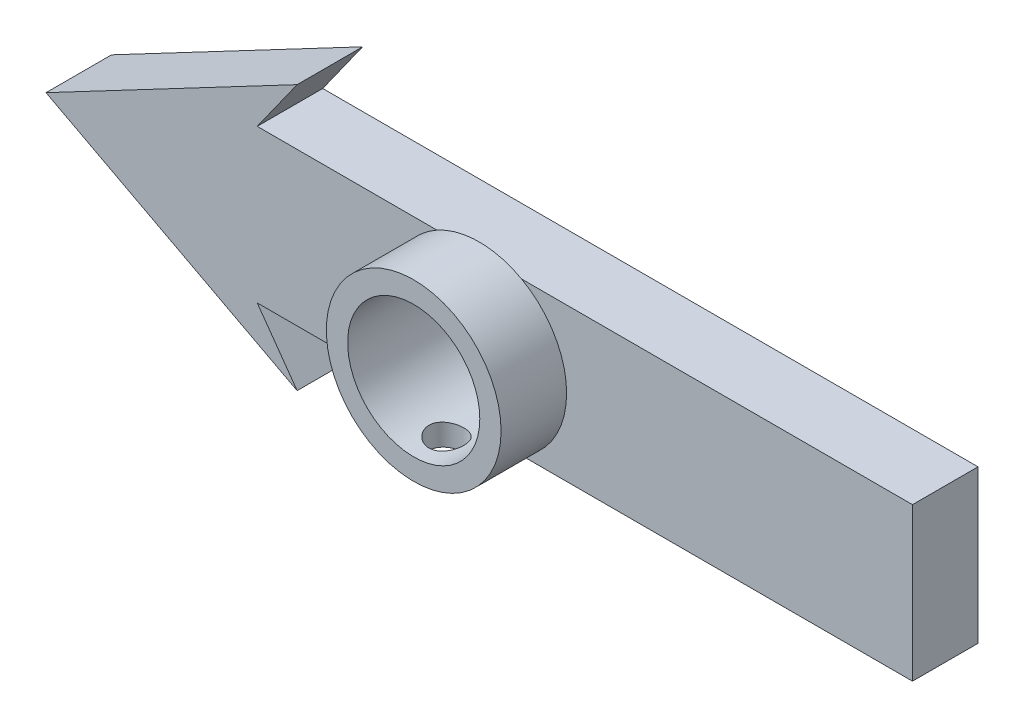
ISO-10303-21;
HEADER;
FILE_DESCRIPTION(('STEP AP214'),'2;1');
FILE_NAME('part.step','',(''),(''),'','','');
FILE_SCHEMA(('AUTOMOTIVE_DESIGN { 1 0 10303 214 1 1 1 1 }'));
ENDSEC;
DATA;
#1=APPLICATION_CONTEXT('core data for automotive mechanical design processes');
#2=APPLICATION_PROTOCOL_DEFINITION('international standard','automotive_design',2000,#1);
#3=PRODUCT_CONTEXT('',#1,'mechanical');
#4=PRODUCT('Part','Part','',(#3));
#5=PRODUCT_RELATED_PRODUCT_CATEGORY('part','',(#4));
#6=PRODUCT_DEFINITION_FORMATION('','',#4);
#7=PRODUCT_DEFINITION_CONTEXT('part definition',#1,'design');
#8=PRODUCT_DEFINITION('design','',#6,#7);
#9=PRODUCT_DEFINITION_SHAPE('','',#8);
#10=(LENGTH_UNIT() NAMED_UNIT(*) SI_UNIT(.MILLI.,.METRE.));
#11=(NAMED_UNIT(*) PLANE_ANGLE_UNIT() SI_UNIT($,.RADIAN.));
#12=(NAMED_UNIT(*) SI_UNIT($,.STERADIAN.) SOLID_ANGLE_UNIT());
#13=UNCERTAINTY_MEASURE_WITH_UNIT(LENGTH_MEASURE(1.E-05),#10,'distance_accuracy_value','');
#14=(GEOMETRIC_REPRESENTATION_CONTEXT(3) GLOBAL_UNCERTAINTY_ASSIGNED_CONTEXT((#13)) GLOBAL_UNIT_ASSIGNED_CONTEXT((#10,
#11,#12)) REPRESENTATION_CONTEXT('',''));
#15=CARTESIAN_POINT('',(0.,0.,0.));
#16=DIRECTION('',(0.,0.,1.));
#17=DIRECTION('',(1.,0.,0.));
#18=AXIS2_PLACEMENT_3D('',#15,#16,#17);
#19=CARTESIAN_POINT('',(0.,0.,3.));
#20=DIRECTION('',(0.,0.,-1.));
#21=DIRECTION('',(-1.,0.,0.));
#22=AXIS2_PLACEMENT_3D('',#19,#20,#21);
#23=PLANE('',#22);
#24=CARTESIAN_POINT('',(19.8350401846511,0.,3.));
#25=DIRECTION('',(0.,0.,1.));
#26=DIRECTION('',(1.,0.,0.));
#27=AXIS2_PLACEMENT_3D('',#24,#25,#26);
#28=CIRCLE('',#27,4.);
#29=CARTESIAN_POINT('',(17.8985485115474,3.5,3.));
#30=VERTEX_POINT('',#29);
#31=CARTESIAN_POINT('',(17.8985485115474,-3.5,3.));
#32=VERTEX_POINT('',#31);
#33=EDGE_CURVE('E11',#30,#32,#28,.T.);
#34=ORIENTED_EDGE('',*,*,#33,.F.);
#35=DIRECTION('',(-1.,0.,0.));
#36=VECTOR('',#35,1.);
#37=CARTESIAN_POINT('',(9.67008036930227,3.5,3.));
#38=LINE('',#37,#36);
#39=CARTESIAN_POINT('',(9.67008036930227,3.5,3.));
#40=VERTEX_POINT('',#39);
#41=EDGE_CURVE('E116',#30,#40,#38,.T.);
#42=ORIENTED_EDGE('',*,*,#41,.T.);
#43=DIRECTION('',(0.580022620305098,0.814600368238567,0.));
#44=VECTOR('',#43,1.);
#45=CARTESIAN_POINT('',(11.4976326065654,6.06666666666667,3.));
#46=LINE('',#45,#44);
#47=CARTESIAN_POINT('',(11.4976326065654,6.06666666666667,3.));
#48=VERTEX_POINT('',#47);
#49=EDGE_CURVE('E113',#40,#48,#46,.T.);
#50=ORIENTED_EDGE('',*,*,#49,.T.);
#51=DIRECTION('',(-0.884433277428106,-0.466666666666667,0.));
#52=VECTOR('',#51,1.);
#53=CARTESIAN_POINT('',(0.,0.,3.));
#54=LINE('',#53,#52);
#55=CARTESIAN_POINT('',(0.,0.,3.));
#56=VERTEX_POINT('',#55);
#57=EDGE_CURVE('E148',#48,#56,#54,.T.);
#58=ORIENTED_EDGE('',*,*,#57,.T.);
#59=DIRECTION('',(0.884433277428106,-0.466666666666667,0.));
#60=VECTOR('',#59,1.);
#61=CARTESIAN_POINT('',(0.,0.,3.));
#62=LINE('',#61,#60);
#63=CARTESIAN_POINT('',(11.4976326065654,-6.06666666666667,3.));
#64=VERTEX_POINT('',#63);
#65=EDGE_CURVE('E136',#56,#64,#62,.T.);
#66=ORIENTED_EDGE('',*,*,#65,.T.);
#67=DIRECTION('',(-0.580022620305098,0.814600368238567,0.));
#68=VECTOR('',#67,1.);
#69=CARTESIAN_POINT('',(11.4976326065654,-6.06666666666667,3.));
#70=LINE('',#69,#68);
#71=CARTESIAN_POINT('',(9.67008036930227,-3.5,3.));
#72=VERTEX_POINT('',#71);
#73=EDGE_CURVE('E139',#64,#72,#70,.T.);
#74=ORIENTED_EDGE('',*,*,#73,.T.);
#75=DIRECTION('',(1.,0.,0.));
#76=VECTOR('',#75,1.);
#77=CARTESIAN_POINT('',(9.67008036930227,-3.5,3.));
#78=LINE('',#77,#76);
#79=EDGE_CURVE('E143',#72,#32,#78,.T.);
#80=ORIENTED_EDGE('',*,*,#79,.T.);
#81=EDGE_LOOP('',(#34,#42,#50,#58,#66,#74,#80));
#82=FACE_BOUND('',#81,.T.);
#83=ADVANCED_FACE('F35',(#82),#23,.F.);
#84=CARTESIAN_POINT('',(0.,0.,3.));
#85=DIRECTION('',(0.466666666666667,0.884433277428107,0.));
#86=DIRECTION('',(-0.884433277428107,0.466666666666667,0.));
#87=AXIS2_PLACEMENT_3D('',#84,#85,#86);
#88=PLANE('',#87);
#89=DIRECTION('',(0.884433277428106,-0.466666666666667,0.));
#90=VECTOR('',#89,1.);
#91=CARTESIAN_POINT('',(0.,0.,0.));
#92=LINE('',#91,#90);
#93=CARTESIAN_POINT('',(0.,0.,0.));
#94=VERTEX_POINT('',#93);
#95=CARTESIAN_POINT('',(11.4976326065654,-6.06666666666667,0.));
#96=VERTEX_POINT('',#95);
#97=EDGE_CURVE('E131',#94,#96,#92,.T.);
#98=ORIENTED_EDGE('',*,*,#97,.T.);
#99=DIRECTION('',(0.,0.,-1.));
#100=VECTOR('',#99,1.);
#101=CARTESIAN_POINT('',(11.4976326065654,-6.06666666666667,3.));
#102=LINE('',#101,#100);
#103=EDGE_CURVE('E39',#64,#96,#102,.T.);
#104=ORIENTED_EDGE('',*,*,#103,.F.);
#105=ORIENTED_EDGE('',*,*,#65,.F.);
#106=DIRECTION('',(0.,0.,-1.));
#107=VECTOR('',#106,1.);
#108=CARTESIAN_POINT('',(0.,0.,3.));
#109=LINE('',#108,#107);
#110=EDGE_CURVE('E150',#56,#94,#109,.T.);
#111=ORIENTED_EDGE('',*,*,#110,.T.);
#112=EDGE_LOOP('',(#98,#104,#105,#111));
#113=FACE_BOUND('',#112,.T.);
#114=ADVANCED_FACE('F37',(#113),#88,.F.);
#115=CARTESIAN_POINT('',(11.4976326065654,-6.06666666666667,3.));
#116=DIRECTION('',(-0.814600368238567,-0.580022620305098,0.));
#117=DIRECTION('',(0.580022620305098,-0.814600368238567,0.));
#118=AXIS2_PLACEMENT_3D('',#115,#116,#117);
#119=PLANE('',#118);
#120=DIRECTION('',(-0.580022620305098,0.814600368238567,0.));
#121=VECTOR('',#120,1.);
#122=CARTESIAN_POINT('',(11.4976326065654,-6.06666666666667,0.));
#123=LINE('',#122,#121);
#124=CARTESIAN_POINT('',(9.67008036930227,-3.5,0.));
#125=VERTEX_POINT('',#124);
#126=EDGE_CURVE('E153',#96,#125,#123,.T.);
#127=ORIENTED_EDGE('',*,*,#126,.T.);
#128=DIRECTION('',(0.,0.,-1.));
#129=VECTOR('',#128,1.);
#130=CARTESIAN_POINT('',(9.67008036930227,-3.5,3.));
#131=LINE('',#130,#129);
#132=EDGE_CURVE('E176',#72,#125,#131,.T.);
#133=ORIENTED_EDGE('',*,*,#132,.F.);
#134=ORIENTED_EDGE('',*,*,#73,.F.);
#135=ORIENTED_EDGE('',*,*,#103,.T.);
#136=EDGE_LOOP('',(#127,#133,#134,#135));
#137=FACE_BOUND('',#136,.T.);
#138=ADVANCED_FACE('F185',(#137),#119,.F.);
#139=CARTESIAN_POINT('',(9.67008036930227,-3.5,3.));
#140=DIRECTION('',(0.,1.,0.));
#141=DIRECTION('',(-1.,0.,0.));
#142=AXIS2_PLACEMENT_3D('',#139,#140,#141);
#143=PLANE('',#142);
#144=DIRECTION('',(1.,0.,0.));
#145=VECTOR('',#144,1.);
#146=CARTESIAN_POINT('',(9.67008036930227,-3.5,0.));
#147=LINE('',#146,#145);
#148=CARTESIAN_POINT('',(39.6700803693023,-3.5,0.));
#149=VERTEX_POINT('',#148);
#150=EDGE_CURVE('E155',#125,#149,#147,.T.);
#151=ORIENTED_EDGE('',*,*,#150,.T.);
#152=DIRECTION('',(0.,0.,-1.));
#153=VECTOR('',#152,1.);
#154=CARTESIAN_POINT('',(39.6700803693023,-3.5,3.));
#155=LINE('',#154,#153);
#156=CARTESIAN_POINT('',(39.6700803693023,-3.5,3.));
#157=VERTEX_POINT('',#156);
#158=EDGE_CURVE('E174',#157,#149,#155,.T.);
#159=ORIENTED_EDGE('',*,*,#158,.F.);
#160=CARTESIAN_POINT('',(21.7715318577548,-3.5,3.));
#161=VERTEX_POINT('',#160);
#162=EDGE_CURVE('E142',#161,#157,#78,.T.);
#163=ORIENTED_EDGE('',*,*,#162,.F.);
#164=EDGE_CURVE('E145',#32,#161,#78,.T.);
#165=ORIENTED_EDGE('',*,*,#164,.F.);
#166=ORIENTED_EDGE('',*,*,#79,.F.);
#167=ORIENTED_EDGE('',*,*,#132,.T.);
#168=EDGE_LOOP('',(#151,#159,#163,#165,#166,#167));
#169=FACE_BOUND('',#168,.T.);
#170=ADVANCED_FACE('F197',(#169),#143,.F.);
#171=CARTESIAN_POINT('',(39.6700803693023,3.5,3.));
#172=DIRECTION('',(-1.,0.,0.));
#173=DIRECTION('',(0.,0.,1.));
#174=AXIS2_PLACEMENT_3D('',#171,#172,#173);
#175=PLANE('',#174);
#176=DIRECTION('',(0.,1.,0.));
#177=VECTOR('',#176,1.);
#178=CARTESIAN_POINT('',(39.6700803693023,3.5,0.));
#179=LINE('',#178,#177);
#180=CARTESIAN_POINT('',(39.6700803693023,3.5,0.));
#181=VERTEX_POINT('',#180);
#182=EDGE_CURVE('E157',#149,#181,#179,.T.);
#183=ORIENTED_EDGE('',*,*,#182,.T.);
#184=DIRECTION('',(0.,0.,-1.));
#185=VECTOR('',#184,1.);
#186=CARTESIAN_POINT('',(39.6700803693023,3.5,3.));
#187=LINE('',#186,#185);
#188=CARTESIAN_POINT('',(39.6700803693023,3.5,3.));
#189=VERTEX_POINT('',#188);
#190=EDGE_CURVE('E172',#189,#181,#187,.T.);
#191=ORIENTED_EDGE('',*,*,#190,.F.);
#192=DIRECTION('',(0.,1.,0.));
#193=VECTOR('',#192,1.);
#194=CARTESIAN_POINT('',(39.6700803693023,3.5,3.));
#195=LINE('',#194,#193);
#196=EDGE_CURVE('E109',#157,#189,#195,.T.);
#197=ORIENTED_EDGE('',*,*,#196,.F.);
#198=ORIENTED_EDGE('',*,*,#158,.T.);
#199=EDGE_LOOP('',(#183,#191,#197,#198));
#200=FACE_BOUND('',#199,.T.);
#201=ADVANCED_FACE('F199',(#200),#175,.F.);
#202=CARTESIAN_POINT('',(9.67008036930227,3.5,3.));
#203=DIRECTION('',(0.,-1.,0.));
#204=DIRECTION('',(1.,0.,0.));
#205=AXIS2_PLACEMENT_3D('',#202,#203,#204);
#206=PLANE('',#205);
#207=DIRECTION('',(-1.,0.,0.));
#208=VECTOR('',#207,1.);
#209=CARTESIAN_POINT('',(9.67008036930227,3.5,0.));
#210=LINE('',#209,#208);
#211=CARTESIAN_POINT('',(9.67008036930227,3.5,0.));
#212=VERTEX_POINT('',#211);
#213=EDGE_CURVE('E159',#181,#212,#210,.T.);
#214=ORIENTED_EDGE('',*,*,#213,.T.);
#215=DIRECTION('',(0.,0.,-1.));
#216=VECTOR('',#215,1.);
#217=CARTESIAN_POINT('',(9.67008036930227,3.5,3.));
#218=LINE('',#217,#216);
#219=EDGE_CURVE('E169',#40,#212,#218,.T.);
#220=ORIENTED_EDGE('',*,*,#219,.F.);
#221=ORIENTED_EDGE('',*,*,#41,.F.);
#222=CARTESIAN_POINT('',(21.7715318577548,3.5,3.));
#223=VERTEX_POINT('',#222);
#224=EDGE_CURVE('E114',#223,#30,#38,.T.);
#225=ORIENTED_EDGE('',*,*,#224,.F.);
#226=EDGE_CURVE('E105',#189,#223,#38,.T.);
#227=ORIENTED_EDGE('',*,*,#226,.F.);
#228=ORIENTED_EDGE('',*,*,#190,.T.);
#229=EDGE_LOOP('',(#214,#220,#221,#225,#227,#228));
#230=FACE_BOUND('',#229,.T.);
#231=ADVANCED_FACE('F118',(#230),#206,.F.);
#232=CARTESIAN_POINT('',(11.4976326065654,6.06666666666667,3.));
#233=DIRECTION('',(-0.814600368238567,0.580022620305098,0.));
#234=DIRECTION('',(-0.580022620305098,-0.814600368238567,0.));
#235=AXIS2_PLACEMENT_3D('',#232,#233,#234);
#236=PLANE('',#235);
#237=DIRECTION('',(0.580022620305098,0.814600368238567,0.));
#238=VECTOR('',#237,1.);
#239=CARTESIAN_POINT('',(11.4976326065654,6.06666666666667,0.));
#240=LINE('',#239,#238);
#241=CARTESIAN_POINT('',(11.4976326065654,6.06666666666667,0.));
#242=VERTEX_POINT('',#241);
#243=EDGE_CURVE('E161',#212,#242,#240,.T.);
#244=ORIENTED_EDGE('',*,*,#243,.T.);
#245=DIRECTION('',(0.,0.,-1.));
#246=VECTOR('',#245,1.);
#247=CARTESIAN_POINT('',(11.4976326065654,6.06666666666667,3.));
#248=LINE('',#247,#246);
#249=EDGE_CURVE('E166',#48,#242,#248,.T.);
#250=ORIENTED_EDGE('',*,*,#249,.F.);
#251=ORIENTED_EDGE('',*,*,#49,.F.);
#252=ORIENTED_EDGE('',*,*,#219,.T.);
#253=EDGE_LOOP('',(#244,#250,#251,#252));
#254=FACE_BOUND('',#253,.T.);
#255=ADVANCED_FACE('F202',(#254),#236,.F.);
#256=CARTESIAN_POINT('',(0.,0.,3.));
#257=DIRECTION('',(0.466666666666667,-0.884433277428107,0.));
#258=DIRECTION('',(0.884433277428107,0.466666666666667,0.));
#259=AXIS2_PLACEMENT_3D('',#256,#257,#258);
#260=PLANE('',#259);
#261=DIRECTION('',(-0.884433277428106,-0.466666666666667,0.));
#262=VECTOR('',#261,1.);
#263=CARTESIAN_POINT('',(0.,0.,0.));
#264=LINE('',#263,#262);
#265=EDGE_CURVE('E140',#242,#94,#264,.T.);
#266=ORIENTED_EDGE('',*,*,#265,.T.);
#267=ORIENTED_EDGE('',*,*,#110,.F.);
#268=ORIENTED_EDGE('',*,*,#57,.F.);
#269=ORIENTED_EDGE('',*,*,#249,.T.);
#270=EDGE_LOOP('',(#266,#267,#268,#269));
#271=FACE_BOUND('',#270,.T.);
#272=ADVANCED_FACE('F206',(#271),#260,.F.);
#273=EDGE_CURVE('E44',#161,#223,#28,.T.);
#274=ORIENTED_EDGE('',*,*,#273,.F.);
#275=ORIENTED_EDGE('',*,*,#162,.T.);
#276=ORIENTED_EDGE('',*,*,#196,.T.);
#277=ORIENTED_EDGE('',*,*,#226,.T.);
#278=EDGE_LOOP('',(#274,#275,#276,#277));
#279=FACE_BOUND('',#278,.T.);
#280=ADVANCED_FACE('F107',(#279),#23,.F.);
#281=CARTESIAN_POINT('',(0.,0.,0.));
#282=DIRECTION('',(0.,0.,-1.));
#283=DIRECTION('',(-1.,0.,0.));
#284=AXIS2_PLACEMENT_3D('',#281,#282,#283);
#285=PLANE('',#284);
#286=CARTESIAN_POINT('',(19.8350401846511,0.,0.));
#287=DIRECTION('',(0.,0.,-1.));
#288=DIRECTION('',(-1.,0.,0.));
#289=AXIS2_PLACEMENT_3D('',#286,#287,#288);
#290=CIRCLE('',#289,3.025);
#291=CARTESIAN_POINT('',(16.8100401846511,0.,0.));
#292=VERTEX_POINT('',#291);
#293=EDGE_CURVE('E344',#292,#292,#290,.F.);
#294=ORIENTED_EDGE('',*,*,#293,.T.);
#295=EDGE_LOOP('',(#294));
#296=FACE_BOUND('',#295,.T.);
#297=ORIENTED_EDGE('',*,*,#97,.F.);
#298=ORIENTED_EDGE('',*,*,#265,.F.);
#299=ORIENTED_EDGE('',*,*,#243,.F.);
#300=ORIENTED_EDGE('',*,*,#213,.F.);
#301=ORIENTED_EDGE('',*,*,#182,.F.);
#302=ORIENTED_EDGE('',*,*,#150,.F.);
#303=ORIENTED_EDGE('',*,*,#126,.F.);
#304=EDGE_LOOP('',(#297,#298,#299,#300,#301,#302,#303));
#305=FACE_BOUND('',#304,.T.);
#306=ADVANCED_FACE('F192',(#296,#305),#285,.T.);
#307=CARTESIAN_POINT('',(19.8350401846511,0.,3.));
#308=DIRECTION('',(0.,0.,1.));
#309=DIRECTION('',(1.,0.,0.));
#310=AXIS2_PLACEMENT_3D('',#307,#308,#309);
#311=PLANE('',#310);
#312=EDGE_CURVE('E46',#32,#161,#28,.T.);
#313=ORIENTED_EDGE('',*,*,#312,.F.);
#314=ORIENTED_EDGE('',*,*,#164,.T.);
#315=EDGE_LOOP('',(#313,#314));
#316=FACE_BOUND('',#315,.T.);
#317=ADVANCED_FACE('F209',(#316),#311,.F.);
#318=EDGE_CURVE('E126',#223,#30,#28,.T.);
#319=ORIENTED_EDGE('',*,*,#318,.F.);
#320=ORIENTED_EDGE('',*,*,#224,.T.);
#321=EDGE_LOOP('',(#319,#320));
#322=FACE_BOUND('',#321,.T.);
#323=ADVANCED_FACE('F128',(#322),#311,.F.);
#324=CARTESIAN_POINT('',(19.8350401846511,0.,6.));
#325=DIRECTION('',(0.,0.,-1.));
#326=DIRECTION('',(-1.,0.,0.));
#327=AXIS2_PLACEMENT_3D('',#324,#325,#326);
#328=CYLINDRICAL_SURFACE('',#327,4.);
#329=CARTESIAN_POINT('',(19.8350401846511,-4.,5.3));
#330=CARTESIAN_POINT('',(19.790578659217,-3.99999918064697,5.29999836440132));
#331=CARTESIAN_POINT('',(19.7460964564899,-3.99925108142585,5.29628092562588));
#332=CARTESIAN_POINT('',(19.6583893784999,-3.99633892498585,5.2815211999078));
#333=CARTESIAN_POINT('',(19.6151655306181,-3.99417374288149,5.27047309375879));
#334=CARTESIAN_POINT('',(19.5312559404405,-3.98866919422629,5.24140698110337));
#335=CARTESIAN_POINT('',(19.4905678103046,-3.98533095261374,5.22339565052425));
#336=CARTESIAN_POINT('',(19.4127937935598,-3.97784318428251,5.18093420199096));
#337=CARTESIAN_POINT('',(19.3757076925905,-3.97369370588566,5.15648446751424));
#338=CARTESIAN_POINT('',(19.3056854027992,-3.96497732263976,5.10148920456685));
#339=CARTESIAN_POINT('',(19.2728050237243,-3.96040596403478,5.07087331568704));
#340=CARTESIAN_POINT('',(19.2126107793647,-3.95139344362071,5.00456606688664));
#341=CARTESIAN_POINT('',(19.1852973488348,-3.94695229200339,4.9688743109319));
#342=CARTESIAN_POINT('',(19.136774781973,-3.93865953450092,4.8930270455905));
#343=CARTESIAN_POINT('',(19.1156234335584,-3.93481365891957,4.85283388496291));
#344=CARTESIAN_POINT('',(19.0803956513869,-3.92821014446734,4.76937454479674));
#345=CARTESIAN_POINT('',(19.0663185187013,-3.92545239809569,4.72610866932292));
#346=CARTESIAN_POINT('',(19.0458199447433,-3.92138244201764,4.63833250887367));
#347=CARTESIAN_POINT('',(19.0393005862841,-3.9200517608575,4.59384596468622));
#348=CARTESIAN_POINT('',(19.0337984824702,-3.91893100048502,4.50439214290853));
#349=CARTESIAN_POINT('',(19.0348149664803,-3.91914076374272,4.45942491494388));
#350=CARTESIAN_POINT('',(19.0442765261697,-3.92106040918548,4.3710025695832));
#351=CARTESIAN_POINT('',(19.052609352456,-3.92274762287011,4.32753487549815));
#352=CARTESIAN_POINT('',(19.0762898769527,-3.92739636928001,4.2426271386696));
#353=CARTESIAN_POINT('',(19.0916379101706,-3.93035796286223,4.20118719286479));
#354=CARTESIAN_POINT('',(19.1290203577114,-3.93724494800326,4.12118779063712));
#355=CARTESIAN_POINT('',(19.1510992636654,-3.94117671850963,4.08264969634466));
#356=CARTESIAN_POINT('',(19.201285324993,-3.94955695018449,4.00978332002175));
#357=CARTESIAN_POINT('',(19.2293931731657,-3.95400547070693,3.97545552251908));
#358=CARTESIAN_POINT('',(19.2914402370027,-3.96301616993169,3.91133647803445));
#359=CARTESIAN_POINT('',(19.3254752556812,-3.96757895368724,3.8816379457127));
#360=CARTESIAN_POINT('',(19.3980921654015,-3.97623078971527,3.82835692295902));
#361=CARTESIAN_POINT('',(19.4366741147476,-3.98031983591179,3.80477451096514));
#362=CARTESIAN_POINT('',(19.517392675148,-3.9875735212871,3.76437799261922));
#363=CARTESIAN_POINT('',(19.5595347289829,-3.99073671078617,3.74757448508437));
#364=CARTESIAN_POINT('',(19.6461210034922,-3.99577127190287,3.72131162076915));
#365=CARTESIAN_POINT('',(19.6905649445932,-3.99764280000425,3.7118513743411));
#366=CARTESIAN_POINT('',(19.7796966601494,-3.99986137493494,3.70067483696458));
#367=CARTESIAN_POINT('',(19.8243679219907,-4.00023339721976,3.69883166436779));
#368=CARTESIAN_POINT('',(19.9133801320053,-3.99948041544082,3.70259988715374));
#369=CARTESIAN_POINT('',(19.9577210986062,-3.99835549553157,3.70821086348208));
#370=CARTESIAN_POINT('',(20.0444047126084,-3.99475065606414,3.72662269883516));
#371=CARTESIAN_POINT('',(20.0867617433231,-3.99228301123365,3.73935845479832));
#372=CARTESIAN_POINT('',(20.1687390866509,-3.98626841648826,3.77158718612465));
#373=CARTESIAN_POINT('',(20.2083591939612,-3.98272138571381,3.79108066774146));
#374=CARTESIAN_POINT('',(20.2842731236001,-3.97487929226635,3.83654599252105));
#375=CARTESIAN_POINT('',(20.3205202860529,-3.97057560349641,3.86259422483116));
#376=CARTESIAN_POINT('',(20.3881745999465,-3.96171787863906,3.92032735296583));
#377=CARTESIAN_POINT('',(20.4195812317957,-3.9571638157471,3.95201285311989));
#378=CARTESIAN_POINT('',(20.4771526572705,-3.94823442845572,4.0206986815129));
#379=CARTESIAN_POINT('',(20.5032303466101,-3.94386288186643,4.05777259537707));
#380=CARTESIAN_POINT('',(20.5487885206921,-3.93587353436955,4.13584908908534));
#381=CARTESIAN_POINT('',(20.5682692693895,-3.93225570330674,4.17685151165884));
#382=CARTESIAN_POINT('',(20.5999616579167,-3.92621392467506,4.26141459691963));
#383=CARTESIAN_POINT('',(20.612210984484,-3.92378379897749,4.30496067296825));
#384=CARTESIAN_POINT('',(20.6292071059529,-3.9203794943362,4.39354676279272));
#385=CARTESIAN_POINT('',(20.6339548792312,-3.91940512552889,4.43858658096747));
#386=CARTESIAN_POINT('',(20.6357769133451,-3.91903319705103,4.52800709163545));
#387=CARTESIAN_POINT('',(20.6329888151079,-3.91960735351441,4.5723849191416));
#388=CARTESIAN_POINT('',(20.6201220279312,-3.92220458787691,4.66002531992402));
#389=CARTESIAN_POINT('',(20.6100433975546,-3.92422765413735,4.70328790215584));
#390=CARTESIAN_POINT('',(20.5829430394503,-3.92948211375327,4.78738216899243));
#391=CARTESIAN_POINT('',(20.565938190025,-3.93271056815064,4.82821948840193));
#392=CARTESIAN_POINT('',(20.5254839003324,-3.94001371979336,4.90648297658755));
#393=CARTESIAN_POINT('',(20.502033919671,-3.94408848799115,4.94390885898011));
#394=CARTESIAN_POINT('',(20.4488849164803,-3.9527116841858,5.01497245772025));
#395=CARTESIAN_POINT('',(20.4190864944393,-3.9572669832776,5.04853501221407));
#396=CARTESIAN_POINT('',(20.3542916798616,-3.96628865497564,5.11022896442333));
#397=CARTESIAN_POINT('',(20.3192940943738,-3.97075500690547,5.13835911225381));
#398=CARTESIAN_POINT('',(20.2446542879217,-3.97915065910377,5.18866771515715));
#399=CARTESIAN_POINT('',(20.204967292195,-3.98307384975397,5.21078080262402));
#400=CARTESIAN_POINT('',(20.1223732734037,-3.98988100068,5.24798889807727));
#401=CARTESIAN_POINT('',(20.0794691933416,-3.99276589710893,5.26309023162599));
#402=CARTESIAN_POINT('',(20.0028973757902,-3.99661098076296,5.28292155843577));
#403=CARTESIAN_POINT('',(19.9696655158622,-3.99787442526761,5.2893145549662));
#404=CARTESIAN_POINT('',(19.9026398048192,-3.99956923311914,5.29785432988669));
#405=CARTESIAN_POINT('',(19.86884597165,-4.00000062298524,5.30000124360781));
#406=CARTESIAN_POINT('',(19.8350401846511,-4.,5.3));
#407=B_SPLINE_CURVE_WITH_KNOTS('',3,(#329,#330,#331,#332,#333,#334,#335,#336,#337,#338,#339,
#340,#341,#342,#343,#344,#345,#346,#347,#348,#349,#350,#351,#352,#353,#354,#355,#356,#357,#358,
#359,#360,#361,#362,#363,#364,#365,#366,#367,#368,#369,#370,#371,#372,#373,#374,#375,#376,#377,
#378,#379,#380,#381,#382,#383,#384,#385,#386,#387,#388,#389,#390,#391,#392,#393,#394,#395,#396,
#397,#398,#399,#400,#401,#402,#403,#404,#405,#406),.UNSPECIFIED.,.T.,.F.,(4,2,2,2,2,2,2,2,2,2,2,
2,2,2,2,2,2,2,2,2,2,2,2,2,2,2,2,2,2,2,2,2,2,2,2,2,2,2,4),(0.,0.133260904529008,
0.266627720553057,0.39986698820027,0.533098321784688,0.667946136089745,0.802804477397891,
0.938889560047378,1.07496119492157,1.20924948082869,1.3435240342498,1.47577381605022,
1.60802991402983,1.74117992162873,1.87434523799736,2.0099060199308,2.14546854031856,
2.28124219883219,2.41699940558428,2.55048588541012,2.68396486126294,2.81624363160578,
2.94853231372817,3.08244052826686,3.21636310676744,3.3523250286338,3.48828150978772,
3.62352304826177,3.75874694664331,3.8915177805416,4.02428754794086,4.15673569002487,
4.28919494065492,4.42390460991314,4.55864523626344,4.69479597340509,4.83082364414014,
4.93215020231914,5.03347353096796),.UNSPECIFIED.);
#408=CARTESIAN_POINT('',(19.8350401846511,-4.,5.3));
#409=VERTEX_POINT('',#408);
#410=EDGE_CURVE('E338',#409,#409,#407,.T.);
#411=ORIENTED_EDGE('',*,*,#410,.F.);
#412=EDGE_LOOP('',(#411));
#413=FACE_BOUND('',#412,.T.);
#414=CARTESIAN_POINT('',(19.8350401846511,0.,6.));
#415=DIRECTION('',(0.,0.,1.));
#416=DIRECTION('',(1.,0.,0.));
#417=AXIS2_PLACEMENT_3D('',#414,#415,#416);
#418=CIRCLE('',#417,4.);
#419=CARTESIAN_POINT('',(23.8350401846511,0.,6.));
#420=VERTEX_POINT('',#419);
#421=EDGE_CURVE('E129',#420,#420,#418,.T.);
#422=ORIENTED_EDGE('',*,*,#421,.F.);
#423=EDGE_LOOP('',(#422));
#424=FACE_BOUND('',#423,.T.);
#425=ORIENTED_EDGE('',*,*,#318,.T.);
#426=ORIENTED_EDGE('',*,*,#33,.T.);
#427=ORIENTED_EDGE('',*,*,#312,.T.);
#428=ORIENTED_EDGE('',*,*,#273,.T.);
#429=EDGE_LOOP('',(#425,#426,#427,#428));
#430=FACE_BOUND('',#429,.T.);
#431=ADVANCED_FACE('F125',(#413,#424,#430),#328,.T.);
#432=CARTESIAN_POINT('',(19.8350401846511,0.,6.));
#433=DIRECTION('',(0.,0.,1.));
#434=DIRECTION('',(1.,0.,0.));
#435=AXIS2_PLACEMENT_3D('',#432,#433,#434);
#436=PLANE('',#435);
#437=CARTESIAN_POINT('',(19.8350401846511,0.,6.));
#438=DIRECTION('',(0.,0.,1.));
#439=DIRECTION('',(1.,0.,0.));
#440=AXIS2_PLACEMENT_3D('',#437,#438,#439);
#441=CIRCLE('',#440,3.025);
#442=CARTESIAN_POINT('',(22.8600401846511,0.,6.));
#443=VERTEX_POINT('',#442);
#444=EDGE_CURVE('E133',#443,#443,#441,.T.);
#445=ORIENTED_EDGE('',*,*,#444,.F.);
#446=EDGE_LOOP('',(#445));
#447=FACE_BOUND('',#446,.T.);
#448=ORIENTED_EDGE('',*,*,#421,.T.);
#449=EDGE_LOOP('',(#448));
#450=FACE_BOUND('',#449,.T.);
#451=ADVANCED_FACE('F293',(#447,#450),#436,.T.);
#452=CARTESIAN_POINT('',(19.8350401846511,0.,-0.00100000000000013));
#453=DIRECTION('',(0.,0.,1.));
#454=DIRECTION('',(1.,0.,0.));
#455=AXIS2_PLACEMENT_3D('',#452,#453,#454);
#456=CYLINDRICAL_SURFACE('',#455,3.025);
#457=CARTESIAN_POINT('',(19.8350401846511,-3.025,5.3));
#458=CARTESIAN_POINT('',(19.8791553962452,-3.02499932224319,5.29999892545121));
#459=CARTESIAN_POINT('',(19.9232821865711,-3.0240254531158,5.29633872579703));
#460=CARTESIAN_POINT('',(20.0102654801861,-3.02023504644452,5.28182000667694));
#461=CARTESIAN_POINT('',(20.0531213466025,-3.01741760084727,5.27095793989727));
#462=CARTESIAN_POINT('',(20.1362945785452,-3.01025115086492,5.24241266354656));
#463=CARTESIAN_POINT('',(20.1766151105835,-3.00590410353821,5.22473816743665));
#464=CARTESIAN_POINT('',(20.2537195262333,-2.99613833625605,5.18310182660626));
#465=CARTESIAN_POINT('',(20.2905031894552,-2.99071954958252,5.15913959043008));
#466=CARTESIAN_POINT('',(20.3603297357938,-2.9792574187581,5.10503018677773));
#467=CARTESIAN_POINT('',(20.3932803392676,-2.973203538056,5.07476616426055));
#468=CARTESIAN_POINT('',(20.4537025169986,-2.96122150040223,5.00916212500279));
#469=CARTESIAN_POINT('',(20.4811733981312,-2.9552933594399,4.9738214670949));
#470=CARTESIAN_POINT('',(20.530304109301,-2.9441264396478,4.89833348706738));
#471=CARTESIAN_POINT('',(20.5518581769232,-2.93890096585341,4.8581151816542));
#472=CARTESIAN_POINT('',(20.587862349401,-2.92988577514898,4.77446509721844));
#473=CARTESIAN_POINT('',(20.6023137402393,-2.92609579836202,4.73103390154864));
#474=CARTESIAN_POINT('',(20.6233826216071,-2.92048943499608,4.64321189972327));
#475=CARTESIAN_POINT('',(20.6301672343293,-2.91863101927515,4.59886393489742));
#476=CARTESIAN_POINT('',(20.6362309340062,-2.91697259096672,4.50962332135602));
#477=CARTESIAN_POINT('',(20.6355113984391,-2.91717220060345,4.46473077411636));
#478=CARTESIAN_POINT('',(20.6267199943164,-2.9195696315441,4.37697654304662));
#479=CARTESIAN_POINT('',(20.6188499284014,-2.92171260403595,4.33409290599841));
#480=CARTESIAN_POINT('',(20.5963039032491,-2.92766753404706,4.25027745595959));
#481=CARTESIAN_POINT('',(20.5816274080528,-2.93147962299634,4.20934579695366));
#482=CARTESIAN_POINT('',(20.5457196788588,-2.94039177500884,4.13006813518248));
#483=CARTESIAN_POINT('',(20.5244173610819,-2.9455056908745,4.09175595184956));
#484=CARTESIAN_POINT('',(20.475912288297,-2.95643779011322,4.01917889128369));
#485=CARTESIAN_POINT('',(20.4487083891106,-2.96225610995689,3.98491480087353));
#486=CARTESIAN_POINT('',(20.3881387114584,-2.97417010530146,3.92025310120462));
#487=CARTESIAN_POINT('',(20.3546033556075,-2.98026869274261,3.89001465420732));
#488=CARTESIAN_POINT('',(20.2828633535916,-2.99188867872063,3.83555854546924));
#489=CARTESIAN_POINT('',(20.2446585294348,-2.99741005524037,3.81134111334546));
#490=CARTESIAN_POINT('',(20.1644202393951,-3.00728655459728,3.76954599590647));
#491=CARTESIAN_POINT('',(20.122371322146,-3.01163666621077,3.75199671253727));
#492=CARTESIAN_POINT('',(20.0357788166024,-3.01864424778725,3.72426187219438));
#493=CARTESIAN_POINT('',(19.9912357663869,-3.02130208131986,3.71407473347143));
#494=CARTESIAN_POINT('',(19.9022780662337,-3.02457081847858,3.70160233546438));
#495=CARTESIAN_POINT('',(19.8578957765689,-3.02523777448174,3.69910063495982));
#496=CARTESIAN_POINT('',(19.7693459300956,-3.02461055825274,3.70147295252101));
#497=CARTESIAN_POINT('',(19.7251783519416,-3.02331658513738,3.70634622171699));
#498=CARTESIAN_POINT('',(19.6390814288204,-3.01894906954996,3.72315248871173));
#499=CARTESIAN_POINT('',(19.5971269072056,-3.01590588650307,3.73496512151639));
#500=CARTESIAN_POINT('',(19.5157987695946,-3.00838483101976,3.76517533547686));
#501=CARTESIAN_POINT('',(19.4764254314277,-3.00390680444642,3.78357362411644));
#502=CARTESIAN_POINT('',(19.4005335787807,-2.99388104641153,3.82683679050349));
#503=CARTESIAN_POINT('',(19.3640850317722,-2.98831429603441,3.85181988747366));
#504=CARTESIAN_POINT('',(19.2958215131962,-2.97675476020495,3.90739453680833));
#505=CARTESIAN_POINT('',(19.2640074433968,-2.9707618921761,3.93798717805899));
#506=CARTESIAN_POINT('',(19.2050066161871,-2.95881992207768,4.00492191798451));
#507=CARTESIAN_POINT('',(19.1779724559239,-2.95287663117959,4.04139980953269));
#508=CARTESIAN_POINT('',(19.1304063589152,-2.94188959636135,4.11849967469158));
#509=CARTESIAN_POINT('',(19.109874147544,-2.93684581445219,4.15912147317855));
#510=CARTESIAN_POINT('',(19.0760493528599,-2.92828661160137,4.24315077385686));
#511=CARTESIAN_POINT('',(19.06271463788,-2.92476232107228,4.28654036446666));
#512=CARTESIAN_POINT('',(19.04356198785,-2.91963823504378,4.37505477126633));
#513=CARTESIAN_POINT('',(19.0377421703101,-2.91803795758397,4.42017914997215));
#514=CARTESIAN_POINT('',(19.033891481953,-2.91698287623959,4.50932124237178));
#515=CARTESIAN_POINT('',(19.0356155392639,-2.91746056414204,4.55332773054664));
#516=CARTESIAN_POINT('',(19.0462362098156,-2.92034980084135,4.64039849357709));
#517=CARTESIAN_POINT('',(19.0551326442111,-2.92276130141797,4.68346279189899));
#518=CARTESIAN_POINT('',(19.0797045367624,-2.92920660600117,4.76712399194551));
#519=CARTESIAN_POINT('',(19.0953288729486,-2.93322816014022,4.80773691846293));
#520=CARTESIAN_POINT('',(19.1328732696341,-2.94244092350604,4.88579547410045));
#521=CARTESIAN_POINT('',(19.1547943027167,-2.94763231339808,4.92324061276878));
#522=CARTESIAN_POINT('',(19.2050560423043,-2.95878772903816,4.99507243185443));
#523=CARTESIAN_POINT('',(19.2335643704405,-2.96476978488742,5.02933904070653));
#524=CARTESIAN_POINT('',(19.2958715972759,-2.97673089661133,5.09268161388355));
#525=CARTESIAN_POINT('',(19.3296717760939,-2.982709951408,5.12175631861477));
#526=CARTESIAN_POINT('',(19.4024571218031,-2.9941410209805,5.17448744536222));
#527=CARTESIAN_POINT('',(19.4415360224757,-2.99957938174844,5.19801769328223));
#528=CARTESIAN_POINT('',(19.5232370418228,-3.00916771008596,5.23813745455682));
#529=CARTESIAN_POINT('',(19.5658568287127,-3.01331851715628,5.25473149286832));
#530=CARTESIAN_POINT('',(19.6461149308314,-3.0193167867065,5.27830259592411));
#531=CARTESIAN_POINT('',(19.6834021741666,-3.02143258329422,5.28642040499455));
#532=CARTESIAN_POINT('',(19.7588035104142,-3.02427441656635,5.29726931465429));
#533=CARTESIAN_POINT('',(19.79691752418,-3.02500058569124,5.30000092858352));
#534=CARTESIAN_POINT('',(19.8350401846511,-3.025,5.3));
#535=B_SPLINE_CURVE_WITH_KNOTS('',3,(#457,#458,#459,#460,#461,#462,#463,#464,#465,#466,#467,
#468,#469,#470,#471,#472,#473,#474,#475,#476,#477,#478,#479,#480,#481,#482,#483,#484,#485,#486,
#487,#488,#489,#490,#491,#492,#493,#494,#495,#496,#497,#498,#499,#500,#501,#502,#503,#504,#505,
#506,#507,#508,#509,#510,#511,#512,#513,#514,#515,#516,#517,#518,#519,#520,#521,#522,#523,#524,
#525,#526,#527,#528,#529,#530,#531,#532,#533,#534),.UNSPECIFIED.,.T.,.F.,(4,2,2,2,2,2,2,2,2,2,2,
2,2,2,2,2,2,2,2,2,2,2,2,2,2,2,2,2,2,2,2,2,2,2,2,2,2,2,4),(0.,0.13220584284575,0.26447685272928,
0.396579239354186,0.528689852226708,0.663512137842464,0.79835146619644,0.935463769974056,
1.07255123958498,1.20658904197832,1.34060224052849,1.47094694902655,1.6013019230095,
1.73310665143732,1.86493695658525,2.00099340974513,2.13705505074848,2.2736898965538,
2.41029537776794,2.54301670446445,2.67572455526569,2.80619582068827,2.93668110658553,
3.06969081694968,3.20272637362939,3.33944722293591,3.47616229673715,3.61206816094644,
3.74793997398224,3.8794311798744,4.01091910709351,4.14142508138915,4.27195122439329,
4.40625975302724,4.54060082174832,4.67775431373605,4.81481819108556,4.92907625978589,
5.04332343841198),.UNSPECIFIED.);
#536=CARTESIAN_POINT('',(19.8350401846511,-3.025,5.3));
#537=VERTEX_POINT('',#536);
#538=EDGE_CURVE('E333',#537,#537,#535,.T.);
#539=ORIENTED_EDGE('',*,*,#538,.F.);
#540=EDGE_LOOP('',(#539));
#541=FACE_BOUND('',#540,.T.);
#542=ORIENTED_EDGE('',*,*,#293,.F.);
#543=EDGE_LOOP('',(#542));
#544=FACE_BOUND('',#543,.T.);
#545=ORIENTED_EDGE('',*,*,#444,.T.);
#546=EDGE_LOOP('',(#545));
#547=FACE_BOUND('',#546,.T.);
#548=ADVANCED_FACE('F302',(#541,#544,#547),#456,.F.);
#549=CARTESIAN_POINT('',(19.8350401846511,-6.06766666666667,4.5));
#550=DIRECTION('',(0.,1.,0.));
#551=DIRECTION('',(0.,0.,1.));
#552=AXIS2_PLACEMENT_3D('',#549,#550,#551);
#553=CYLINDRICAL_SURFACE('',#552,0.799999999999999);
#554=ORIENTED_EDGE('',*,*,#538,.T.);
#555=EDGE_LOOP('',(#554));
#556=FACE_BOUND('',#555,.T.);
#557=ORIENTED_EDGE('',*,*,#410,.T.);
#558=EDGE_LOOP('',(#557));
#559=FACE_BOUND('',#558,.T.);
#560=ADVANCED_FACE('F309',(#556,#559),#553,.F.);
#561=CLOSED_SHELL('',(#83,#114,#138,#170,#201,#231,#255,#272,#280,#306,#317,#323,#431,#451,#548,#560));
#562=MANIFOLD_SOLID_BREP('B2',#561);
#563=ADVANCED_BREP_SHAPE_REPRESENTATION('',(#18,#562),#14);
#564=SHAPE_DEFINITION_REPRESENTATION(#9,#563);
ENDSEC;
END-ISO-10303-21;
